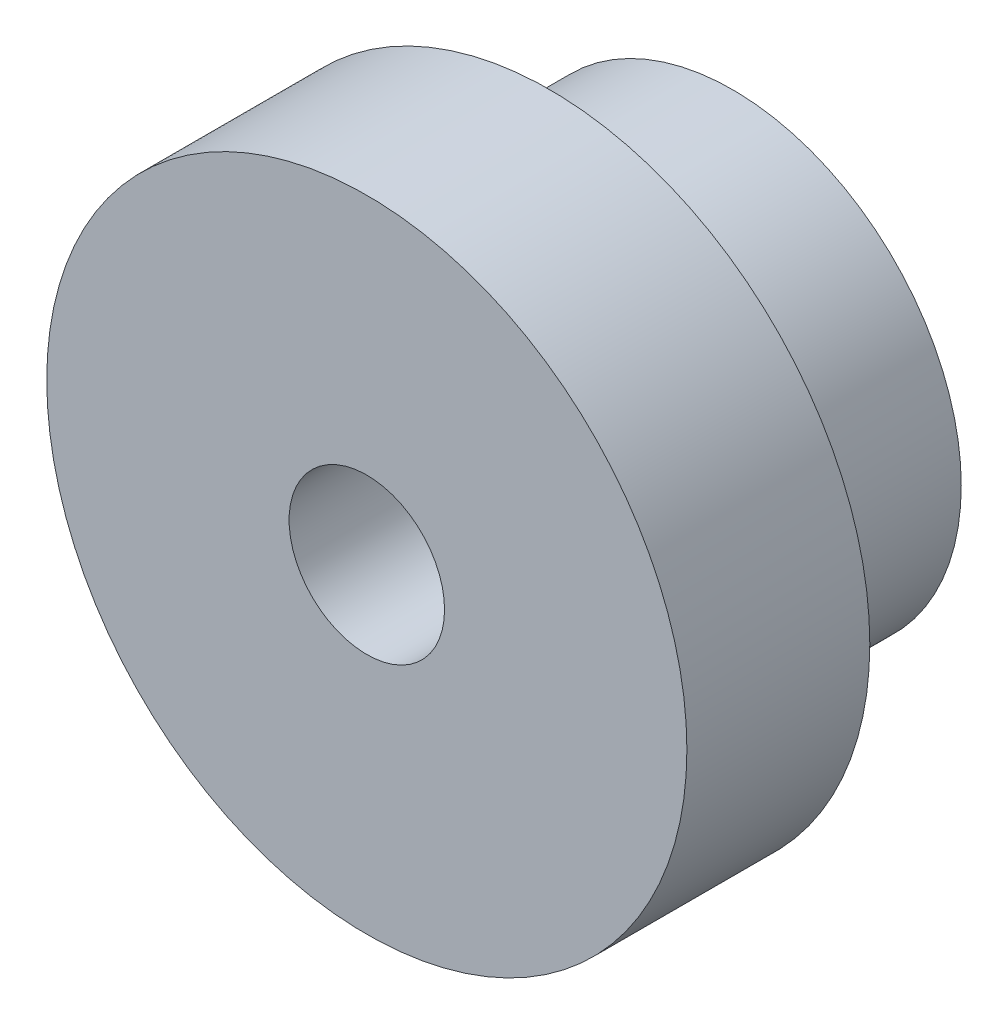
ISO-10303-21;
HEADER;
FILE_DESCRIPTION(('STEP AP214'),'2;1');
FILE_NAME('part.step','',(''),(''),'','','');
FILE_SCHEMA(('AUTOMOTIVE_DESIGN { 1 0 10303 214 1 1 1 1 }'));
ENDSEC;
DATA;
#1=APPLICATION_CONTEXT('core data for automotive mechanical design processes');
#2=APPLICATION_PROTOCOL_DEFINITION('international standard','automotive_design',2000,#1);
#3=PRODUCT_CONTEXT('',#1,'mechanical');
#4=PRODUCT('Part','Part','',(#3));
#5=PRODUCT_RELATED_PRODUCT_CATEGORY('part','',(#4));
#6=PRODUCT_DEFINITION_FORMATION('','',#4);
#7=PRODUCT_DEFINITION_CONTEXT('part definition',#1,'design');
#8=PRODUCT_DEFINITION('design','',#6,#7);
#9=PRODUCT_DEFINITION_SHAPE('','',#8);
#10=(LENGTH_UNIT() NAMED_UNIT(*) SI_UNIT(.MILLI.,.METRE.));
#11=(NAMED_UNIT(*) PLANE_ANGLE_UNIT() SI_UNIT($,.RADIAN.));
#12=(NAMED_UNIT(*) SI_UNIT($,.STERADIAN.) SOLID_ANGLE_UNIT());
#13=UNCERTAINTY_MEASURE_WITH_UNIT(LENGTH_MEASURE(1.E-05),#10,'distance_accuracy_value','');
#14=(GEOMETRIC_REPRESENTATION_CONTEXT(3) GLOBAL_UNCERTAINTY_ASSIGNED_CONTEXT((#13)) GLOBAL_UNIT_ASSIGNED_CONTEXT((#10,
#11,#12)) REPRESENTATION_CONTEXT('',''));
#15=CARTESIAN_POINT('',(0.,0.,0.));
#16=DIRECTION('',(0.,0.,1.));
#17=DIRECTION('',(1.,0.,0.));
#18=AXIS2_PLACEMENT_3D('',#15,#16,#17);
#19=CARTESIAN_POINT('',(0.,0.,4.));
#20=DIRECTION('',(0.,0.,-1.));
#21=DIRECTION('',(-1.,0.,0.));
#22=AXIS2_PLACEMENT_3D('',#19,#20,#21);
#23=CYLINDRICAL_SURFACE('',#22,5.);
#24=CARTESIAN_POINT('',(0.,0.,4.));
#25=DIRECTION('',(0.,0.,1.));
#26=DIRECTION('',(1.,0.,0.));
#27=AXIS2_PLACEMENT_3D('',#24,#25,#26);
#28=CIRCLE('',#27,5.);
#29=CARTESIAN_POINT('',(5.,0.,4.));
#30=VERTEX_POINT('',#29);
#31=EDGE_CURVE('E10',#30,#30,#28,.T.);
#32=ORIENTED_EDGE('',*,*,#31,.F.);
#33=EDGE_LOOP('',(#32));
#34=FACE_BOUND('',#33,.T.);
#35=CARTESIAN_POINT('',(0.,0.,0.));
#36=DIRECTION('',(0.,0.,1.));
#37=DIRECTION('',(1.,0.,0.));
#38=AXIS2_PLACEMENT_3D('',#35,#36,#37);
#39=CIRCLE('',#38,5.);
#40=CARTESIAN_POINT('',(5.,0.,0.));
#41=VERTEX_POINT('',#40);
#42=EDGE_CURVE('E34',#41,#41,#39,.T.);
#43=ORIENTED_EDGE('',*,*,#42,.T.);
#44=EDGE_LOOP('',(#43));
#45=FACE_BOUND('',#44,.T.);
#46=ADVANCED_FACE('F31',(#34,#45),#23,.T.);
#47=CARTESIAN_POINT('',(0.,0.,0.));
#48=DIRECTION('',(0.,0.,1.));
#49=DIRECTION('',(1.,0.,0.));
#50=AXIS2_PLACEMENT_3D('',#47,#48,#49);
#51=PLANE('',#50);
#52=CARTESIAN_POINT('',(0.,0.,0.));
#53=DIRECTION('',(0.,0.,1.));
#54=DIRECTION('',(1.,0.,0.));
#55=AXIS2_PLACEMENT_3D('',#52,#53,#54);
#56=CIRCLE('',#55,1.69999999999999);
#57=CARTESIAN_POINT('',(1.69999999999999,0.,0.));
#58=VERTEX_POINT('',#57);
#59=EDGE_CURVE('E46',#58,#58,#56,.T.);
#60=ORIENTED_EDGE('',*,*,#59,.T.);
#61=EDGE_LOOP('',(#60));
#62=FACE_BOUND('',#61,.T.);
#63=ORIENTED_EDGE('',*,*,#42,.F.);
#64=EDGE_LOOP('',(#63));
#65=FACE_BOUND('',#64,.T.);
#66=ADVANCED_FACE('F67',(#62,#65),#51,.F.);
#67=CARTESIAN_POINT('',(0.,0.,8.));
#68=DIRECTION('',(0.,0.,-1.));
#69=DIRECTION('',(-1.,0.,0.));
#70=AXIS2_PLACEMENT_3D('',#67,#68,#69);
#71=CYLINDRICAL_SURFACE('',#70,7.);
#72=CARTESIAN_POINT('',(0.,0.,8.));
#73=DIRECTION('',(0.,0.,1.));
#74=DIRECTION('',(1.,0.,0.));
#75=AXIS2_PLACEMENT_3D('',#72,#73,#74);
#76=CIRCLE('',#75,7.);
#77=CARTESIAN_POINT('',(7.,0.,8.));
#78=VERTEX_POINT('',#77);
#79=EDGE_CURVE('E41',#78,#78,#76,.T.);
#80=ORIENTED_EDGE('',*,*,#79,.F.);
#81=EDGE_LOOP('',(#80));
#82=FACE_BOUND('',#81,.T.);
#83=CARTESIAN_POINT('',(0.,0.,4.));
#84=DIRECTION('',(0.,0.,1.));
#85=DIRECTION('',(1.,0.,0.));
#86=AXIS2_PLACEMENT_3D('',#83,#84,#85);
#87=CIRCLE('',#86,7.);
#88=CARTESIAN_POINT('',(7.,0.,4.));
#89=VERTEX_POINT('',#88);
#90=EDGE_CURVE('E43',#89,#89,#87,.T.);
#91=ORIENTED_EDGE('',*,*,#90,.T.);
#92=EDGE_LOOP('',(#91));
#93=FACE_BOUND('',#92,.T.);
#94=ADVANCED_FACE('F61',(#82,#93),#71,.T.);
#95=CARTESIAN_POINT('',(0.,0.,8.));
#96=DIRECTION('',(0.,0.,1.));
#97=DIRECTION('',(1.,0.,0.));
#98=AXIS2_PLACEMENT_3D('',#95,#96,#97);
#99=PLANE('',#98);
#100=CARTESIAN_POINT('',(0.,0.,8.));
#101=DIRECTION('',(0.,0.,1.));
#102=DIRECTION('',(1.,0.,0.));
#103=AXIS2_PLACEMENT_3D('',#100,#101,#102);
#104=CIRCLE('',#103,1.69999999999999);
#105=CARTESIAN_POINT('',(1.69999999999999,0.,8.));
#106=VERTEX_POINT('',#105);
#107=EDGE_CURVE('E51',#106,#106,#104,.T.);
#108=ORIENTED_EDGE('',*,*,#107,.F.);
#109=EDGE_LOOP('',(#108));
#110=FACE_BOUND('',#109,.T.);
#111=ORIENTED_EDGE('',*,*,#79,.T.);
#112=EDGE_LOOP('',(#111));
#113=FACE_BOUND('',#112,.T.);
#114=ADVANCED_FACE('F57',(#110,#113),#99,.T.);
#115=CARTESIAN_POINT('',(0.,0.,4.));
#116=DIRECTION('',(0.,0.,1.));
#117=DIRECTION('',(1.,0.,0.));
#118=AXIS2_PLACEMENT_3D('',#115,#116,#117);
#119=PLANE('',#118);
#120=ORIENTED_EDGE('',*,*,#31,.T.);
#121=EDGE_LOOP('',(#120));
#122=FACE_BOUND('',#121,.T.);
#123=ORIENTED_EDGE('',*,*,#90,.F.);
#124=EDGE_LOOP('',(#123));
#125=FACE_BOUND('',#124,.T.);
#126=ADVANCED_FACE('F60',(#122,#125),#119,.F.);
#127=CARTESIAN_POINT('',(0.,0.,8.));
#128=DIRECTION('',(0.,0.,1.));
#129=DIRECTION('',(1.,0.,0.));
#130=AXIS2_PLACEMENT_3D('',#127,#128,#129);
#131=CYLINDRICAL_SURFACE('',#130,1.69999999999999);
#132=ORIENTED_EDGE('',*,*,#59,.F.);
#133=EDGE_LOOP('',(#132));
#134=FACE_BOUND('',#133,.T.);
#135=ORIENTED_EDGE('',*,*,#107,.T.);
#136=EDGE_LOOP('',(#135));
#137=FACE_BOUND('',#136,.T.);
#138=ADVANCED_FACE('F55',(#134,#137),#131,.F.);
#139=CLOSED_SHELL('',(#46,#66,#94,#114,#126,#138));
#140=MANIFOLD_SOLID_BREP('B2',#139);
#141=ADVANCED_BREP_SHAPE_REPRESENTATION('',(#18,#140),#14);
#142=SHAPE_DEFINITION_REPRESENTATION(#9,#141);
ENDSEC;
END-ISO-10303-21;
